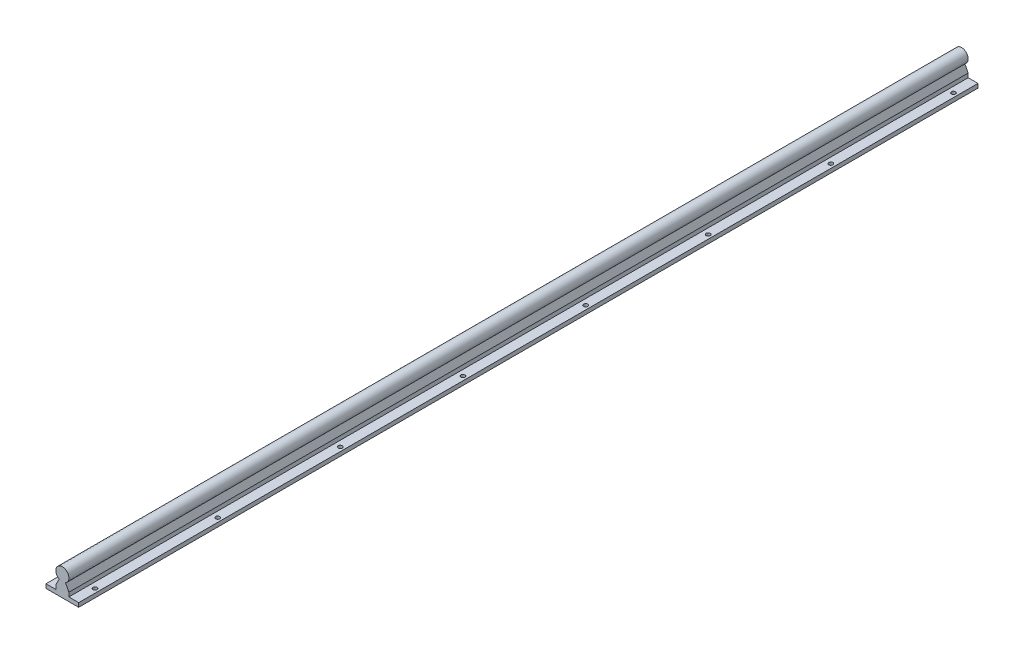
ISO-10303-21;
HEADER;
FILE_DESCRIPTION(('STEP AP214'),'2;1');
FILE_NAME('part.step','',(''),(''),'','','');
FILE_SCHEMA(('AUTOMOTIVE_DESIGN { 1 0 10303 214 1 1 1 1 }'));
ENDSEC;
DATA;
#1=APPLICATION_CONTEXT('core data for automotive mechanical design processes');
#2=APPLICATION_PROTOCOL_DEFINITION('international standard','automotive_design',2000,#1);
#3=PRODUCT_CONTEXT('',#1,'mechanical');
#4=PRODUCT('Part','Part','',(#3));
#5=PRODUCT_RELATED_PRODUCT_CATEGORY('part','',(#4));
#6=PRODUCT_DEFINITION_FORMATION('','',#4);
#7=PRODUCT_DEFINITION_CONTEXT('part definition',#1,'design');
#8=PRODUCT_DEFINITION('design','',#6,#7);
#9=PRODUCT_DEFINITION_SHAPE('','',#8);
#10=(LENGTH_UNIT() NAMED_UNIT(*) SI_UNIT(.MILLI.,.METRE.));
#11=(NAMED_UNIT(*) PLANE_ANGLE_UNIT() SI_UNIT($,.RADIAN.));
#12=(NAMED_UNIT(*) SI_UNIT($,.STERADIAN.) SOLID_ANGLE_UNIT());
#13=UNCERTAINTY_MEASURE_WITH_UNIT(LENGTH_MEASURE(1.E-05),#10,'distance_accuracy_value','');
#14=(GEOMETRIC_REPRESENTATION_CONTEXT(3) GLOBAL_UNCERTAINTY_ASSIGNED_CONTEXT((#13)) GLOBAL_UNIT_ASSIGNED_CONTEXT((#10,
#11,#12)) REPRESENTATION_CONTEXT('',''));
#15=CARTESIAN_POINT('',(0.,0.,0.));
#16=DIRECTION('',(0.,0.,1.));
#17=DIRECTION('',(1.,0.,0.));
#18=AXIS2_PLACEMENT_3D('',#15,#16,#17);
#19=CARTESIAN_POINT('',(-10.3929134539516,5.36146586323541,1100.));
#20=DIRECTION('',(-0.888711896714191,0.458466099770382,0.));
#21=DIRECTION('',(-0.458466099770382,-0.888711896714191,0.));
#22=AXIS2_PLACEMENT_3D('',#19,#20,#21);
#23=PLANE('',#22);
#24=DIRECTION('',(0.458466099770382,0.888711896714191,0.));
#25=VECTOR('',#24,1.);
#26=CARTESIAN_POINT('',(-10.3929134539516,5.36146586323541,0.));
#27=LINE('',#26,#25);
#28=CARTESIAN_POINT('',(-8.,10.,0.));
#29=VERTEX_POINT('',#28);
#30=CARTESIAN_POINT('',(-3.87298334620742,18.,0.));
#31=VERTEX_POINT('',#30);
#32=EDGE_CURVE('E145',#29,#31,#27,.T.);
#33=ORIENTED_EDGE('',*,*,#32,.F.);
#34=DIRECTION('',(0.,0.,-1.));
#35=VECTOR('',#34,1.);
#36=CARTESIAN_POINT('',(-8.,10.,1100.));
#37=LINE('',#36,#35);
#38=CARTESIAN_POINT('',(-8.,10.,1100.));
#39=VERTEX_POINT('',#38);
#40=EDGE_CURVE('E42',#39,#29,#37,.T.);
#41=ORIENTED_EDGE('',*,*,#40,.F.);
#42=DIRECTION('',(0.458466099770382,0.888711896714191,0.));
#43=VECTOR('',#42,1.);
#44=CARTESIAN_POINT('',(-10.3929134539516,5.36146586323541,1100.));
#45=LINE('',#44,#43);
#46=CARTESIAN_POINT('',(-3.87298334620742,18.,1100.));
#47=VERTEX_POINT('',#46);
#48=EDGE_CURVE('E166',#39,#47,#45,.T.);
#49=ORIENTED_EDGE('',*,*,#48,.T.);
#50=DIRECTION('',(0.,0.,-1.));
#51=VECTOR('',#50,1.);
#52=CARTESIAN_POINT('',(-3.87298334620742,18.,1100.));
#53=LINE('',#52,#51);
#54=EDGE_CURVE('E11',#47,#31,#53,.T.);
#55=ORIENTED_EDGE('',*,*,#54,.T.);
#56=EDGE_LOOP('',(#33,#41,#49,#55));
#57=FACE_BOUND('',#56,.T.);
#58=ADVANCED_FACE('F34',(#57),#23,.T.);
#59=CARTESIAN_POINT('',(-8.,0.,1100.));
#60=DIRECTION('',(-1.,0.,0.));
#61=DIRECTION('',(0.,0.,1.));
#62=AXIS2_PLACEMENT_3D('',#59,#60,#61);
#63=PLANE('',#62);
#64=DIRECTION('',(0.,1.,0.));
#65=VECTOR('',#64,1.);
#66=CARTESIAN_POINT('',(-8.,0.,0.));
#67=LINE('',#66,#65);
#68=CARTESIAN_POINT('',(-8.,5.,0.));
#69=VERTEX_POINT('',#68);
#70=EDGE_CURVE('E147',#69,#29,#67,.T.);
#71=ORIENTED_EDGE('',*,*,#70,.F.);
#72=DIRECTION('',(0.,0.,-1.));
#73=VECTOR('',#72,1.);
#74=CARTESIAN_POINT('',(-8.,5.,1100.));
#75=LINE('',#74,#73);
#76=CARTESIAN_POINT('',(-8.,5.,1100.));
#77=VERTEX_POINT('',#76);
#78=EDGE_CURVE('E176',#77,#69,#75,.T.);
#79=ORIENTED_EDGE('',*,*,#78,.F.);
#80=DIRECTION('',(0.,1.,0.));
#81=VECTOR('',#80,1.);
#82=CARTESIAN_POINT('',(-8.,0.,1100.));
#83=LINE('',#82,#81);
#84=EDGE_CURVE('E182',#77,#39,#83,.T.);
#85=ORIENTED_EDGE('',*,*,#84,.T.);
#86=ORIENTED_EDGE('',*,*,#40,.T.);
#87=EDGE_LOOP('',(#71,#79,#85,#86));
#88=FACE_BOUND('',#87,.T.);
#89=ADVANCED_FACE('F180',(#88),#63,.T.);
#90=CARTESIAN_POINT('',(0.,5.,1100.));
#91=DIRECTION('',(0.,1.,0.));
#92=DIRECTION('',(0.,0.,1.));
#93=AXIS2_PLACEMENT_3D('',#90,#91,#92);
#94=PLANE('',#93);
#95=CARTESIAN_POINT('',(-15.,5.,25.0000000000001));
#96=DIRECTION('',(0.,1.,0.));
#97=DIRECTION('',(0.,0.,1.));
#98=AXIS2_PLACEMENT_3D('',#95,#96,#97);
#99=CIRCLE('',#98,2.49999999999999);
#100=CARTESIAN_POINT('',(-15.,5.,27.5000000000001));
#101=VERTEX_POINT('',#100);
#102=EDGE_CURVE('E305',#101,#101,#99,.T.);
#103=ORIENTED_EDGE('',*,*,#102,.F.);
#104=EDGE_LOOP('',(#103));
#105=FACE_BOUND('',#104,.T.);
#106=CARTESIAN_POINT('',(-15.,5.,175.));
#107=DIRECTION('',(0.,1.,0.));
#108=DIRECTION('',(0.,0.,1.));
#109=AXIS2_PLACEMENT_3D('',#106,#107,#108);
#110=CIRCLE('',#109,2.49999999999999);
#111=CARTESIAN_POINT('',(-15.,5.,177.5));
#112=VERTEX_POINT('',#111);
#113=EDGE_CURVE('E293',#112,#112,#110,.T.);
#114=ORIENTED_EDGE('',*,*,#113,.F.);
#115=EDGE_LOOP('',(#114));
#116=FACE_BOUND('',#115,.T.);
#117=CARTESIAN_POINT('',(-15.,5.,325.));
#118=DIRECTION('',(0.,1.,0.));
#119=DIRECTION('',(0.,0.,1.));
#120=AXIS2_PLACEMENT_3D('',#117,#118,#119);
#121=CIRCLE('',#120,2.49999999999999);
#122=CARTESIAN_POINT('',(-15.,5.,327.5));
#123=VERTEX_POINT('',#122);
#124=EDGE_CURVE('E281',#123,#123,#121,.T.);
#125=ORIENTED_EDGE('',*,*,#124,.F.);
#126=EDGE_LOOP('',(#125));
#127=FACE_BOUND('',#126,.T.);
#128=CARTESIAN_POINT('',(-15.,5.,475.));
#129=DIRECTION('',(0.,1.,0.));
#130=DIRECTION('',(0.,0.,1.));
#131=AXIS2_PLACEMENT_3D('',#128,#129,#130);
#132=CIRCLE('',#131,2.49999999999999);
#133=CARTESIAN_POINT('',(-15.,5.,477.5));
#134=VERTEX_POINT('',#133);
#135=EDGE_CURVE('E269',#134,#134,#132,.T.);
#136=ORIENTED_EDGE('',*,*,#135,.F.);
#137=EDGE_LOOP('',(#136));
#138=FACE_BOUND('',#137,.T.);
#139=CARTESIAN_POINT('',(-15.,5.,625.));
#140=DIRECTION('',(0.,1.,0.));
#141=DIRECTION('',(0.,0.,1.));
#142=AXIS2_PLACEMENT_3D('',#139,#140,#141);
#143=CIRCLE('',#142,2.49999999999999);
#144=CARTESIAN_POINT('',(-15.,5.,627.5));
#145=VERTEX_POINT('',#144);
#146=EDGE_CURVE('E257',#145,#145,#143,.T.);
#147=ORIENTED_EDGE('',*,*,#146,.F.);
#148=EDGE_LOOP('',(#147));
#149=FACE_BOUND('',#148,.T.);
#150=CARTESIAN_POINT('',(-15.,5.,775.));
#151=DIRECTION('',(0.,1.,0.));
#152=DIRECTION('',(0.,0.,1.));
#153=AXIS2_PLACEMENT_3D('',#150,#151,#152);
#154=CIRCLE('',#153,2.49999999999999);
#155=CARTESIAN_POINT('',(-15.,5.,777.5));
#156=VERTEX_POINT('',#155);
#157=EDGE_CURVE('E245',#156,#156,#154,.T.);
#158=ORIENTED_EDGE('',*,*,#157,.F.);
#159=EDGE_LOOP('',(#158));
#160=FACE_BOUND('',#159,.T.);
#161=CARTESIAN_POINT('',(-15.,5.,925.));
#162=DIRECTION('',(0.,1.,0.));
#163=DIRECTION('',(0.,0.,1.));
#164=AXIS2_PLACEMENT_3D('',#161,#162,#163);
#165=CIRCLE('',#164,2.49999999999999);
#166=CARTESIAN_POINT('',(-15.,5.,927.5));
#167=VERTEX_POINT('',#166);
#168=EDGE_CURVE('E233',#167,#167,#165,.T.);
#169=ORIENTED_EDGE('',*,*,#168,.F.);
#170=EDGE_LOOP('',(#169));
#171=FACE_BOUND('',#170,.T.);
#172=CARTESIAN_POINT('',(-15.,5.,1075.));
#173=DIRECTION('',(0.,1.,0.));
#174=DIRECTION('',(0.,0.,1.));
#175=AXIS2_PLACEMENT_3D('',#172,#173,#174);
#176=CIRCLE('',#175,2.49999999999999);
#177=CARTESIAN_POINT('',(-15.,5.,1077.5));
#178=VERTEX_POINT('',#177);
#179=EDGE_CURVE('E219',#178,#178,#176,.T.);
#180=ORIENTED_EDGE('',*,*,#179,.F.);
#181=EDGE_LOOP('',(#180));
#182=FACE_BOUND('',#181,.T.);
#183=DIRECTION('',(1.,0.,0.));
#184=VECTOR('',#183,1.);
#185=CARTESIAN_POINT('',(0.,5.,0.));
#186=LINE('',#185,#184);
#187=CARTESIAN_POINT('',(-20.,5.,0.));
#188=VERTEX_POINT('',#187);
#189=EDGE_CURVE('E151',#188,#69,#186,.T.);
#190=ORIENTED_EDGE('',*,*,#189,.F.);
#191=DIRECTION('',(0.,0.,-1.));
#192=VECTOR('',#191,1.);
#193=CARTESIAN_POINT('',(-20.,5.,1100.));
#194=LINE('',#193,#192);
#195=CARTESIAN_POINT('',(-20.,5.,1100.));
#196=VERTEX_POINT('',#195);
#197=EDGE_CURVE('E174',#196,#188,#194,.T.);
#198=ORIENTED_EDGE('',*,*,#197,.F.);
#199=DIRECTION('',(1.,0.,0.));
#200=VECTOR('',#199,1.);
#201=CARTESIAN_POINT('',(0.,5.,1100.));
#202=LINE('',#201,#200);
#203=EDGE_CURVE('E192',#196,#77,#202,.T.);
#204=ORIENTED_EDGE('',*,*,#203,.T.);
#205=ORIENTED_EDGE('',*,*,#78,.T.);
#206=EDGE_LOOP('',(#190,#198,#204,#205));
#207=FACE_BOUND('',#206,.T.);
#208=ADVANCED_FACE('F189',(#105,#116,#127,#138,#149,#160,#171,#182,#207),#94,.T.);
#209=CARTESIAN_POINT('',(-20.,0.,1100.));
#210=DIRECTION('',(-1.,0.,0.));
#211=DIRECTION('',(0.,0.,1.));
#212=AXIS2_PLACEMENT_3D('',#209,#210,#211);
#213=PLANE('',#212);
#214=DIRECTION('',(0.,1.,0.));
#215=VECTOR('',#214,1.);
#216=CARTESIAN_POINT('',(-20.,0.,0.));
#217=LINE('',#216,#215);
#218=CARTESIAN_POINT('',(-20.,0.,0.));
#219=VERTEX_POINT('',#218);
#220=EDGE_CURVE('E154',#219,#188,#217,.T.);
#221=ORIENTED_EDGE('',*,*,#220,.F.);
#222=DIRECTION('',(0.,0.,-1.));
#223=VECTOR('',#222,1.);
#224=CARTESIAN_POINT('',(-20.,0.,1100.));
#225=LINE('',#224,#223);
#226=CARTESIAN_POINT('',(-20.,0.,1100.));
#227=VERTEX_POINT('',#226);
#228=EDGE_CURVE('E172',#227,#219,#225,.T.);
#229=ORIENTED_EDGE('',*,*,#228,.F.);
#230=DIRECTION('',(0.,1.,0.));
#231=VECTOR('',#230,1.);
#232=CARTESIAN_POINT('',(-20.,0.,1100.));
#233=LINE('',#232,#231);
#234=EDGE_CURVE('E196',#227,#196,#233,.T.);
#235=ORIENTED_EDGE('',*,*,#234,.T.);
#236=ORIENTED_EDGE('',*,*,#197,.T.);
#237=EDGE_LOOP('',(#221,#229,#235,#236));
#238=FACE_BOUND('',#237,.T.);
#239=ADVANCED_FACE('F202',(#238),#213,.T.);
#240=CARTESIAN_POINT('',(0.,0.,1100.));
#241=DIRECTION('',(0.,1.,0.));
#242=DIRECTION('',(0.,0.,1.));
#243=AXIS2_PLACEMENT_3D('',#240,#241,#242);
#244=PLANE('',#243);
#245=CARTESIAN_POINT('',(15.,0.,25.0000000000001));
#246=DIRECTION('',(0.,1.,0.));
#247=DIRECTION('',(0.,0.,1.));
#248=AXIS2_PLACEMENT_3D('',#245,#246,#247);
#249=CIRCLE('',#248,2.5);
#250=CARTESIAN_POINT('',(15.,0.,27.5000000000001));
#251=VERTEX_POINT('',#250);
#252=EDGE_CURVE('E308',#251,#251,#249,.T.);
#253=ORIENTED_EDGE('',*,*,#252,.T.);
#254=EDGE_LOOP('',(#253));
#255=FACE_BOUND('',#254,.T.);
#256=CARTESIAN_POINT('',(-15.,0.,25.0000000000001));
#257=DIRECTION('',(0.,1.,0.));
#258=DIRECTION('',(0.,0.,1.));
#259=AXIS2_PLACEMENT_3D('',#256,#257,#258);
#260=CIRCLE('',#259,2.5);
#261=CARTESIAN_POINT('',(-15.,0.,27.5000000000001));
#262=VERTEX_POINT('',#261);
#263=EDGE_CURVE('E302',#262,#262,#260,.T.);
#264=ORIENTED_EDGE('',*,*,#263,.T.);
#265=EDGE_LOOP('',(#264));
#266=FACE_BOUND('',#265,.T.);
#267=CARTESIAN_POINT('',(15.,0.,175.));
#268=DIRECTION('',(0.,1.,0.));
#269=DIRECTION('',(0.,0.,1.));
#270=AXIS2_PLACEMENT_3D('',#267,#268,#269);
#271=CIRCLE('',#270,2.5);
#272=CARTESIAN_POINT('',(15.,0.,177.5));
#273=VERTEX_POINT('',#272);
#274=EDGE_CURVE('E296',#273,#273,#271,.T.);
#275=ORIENTED_EDGE('',*,*,#274,.T.);
#276=EDGE_LOOP('',(#275));
#277=FACE_BOUND('',#276,.T.);
#278=CARTESIAN_POINT('',(-15.,0.,175.));
#279=DIRECTION('',(0.,1.,0.));
#280=DIRECTION('',(0.,0.,1.));
#281=AXIS2_PLACEMENT_3D('',#278,#279,#280);
#282=CIRCLE('',#281,2.5);
#283=CARTESIAN_POINT('',(-15.,0.,177.5));
#284=VERTEX_POINT('',#283);
#285=EDGE_CURVE('E290',#284,#284,#282,.T.);
#286=ORIENTED_EDGE('',*,*,#285,.T.);
#287=EDGE_LOOP('',(#286));
#288=FACE_BOUND('',#287,.T.);
#289=CARTESIAN_POINT('',(15.,0.,325.));
#290=DIRECTION('',(0.,1.,0.));
#291=DIRECTION('',(0.,0.,1.));
#292=AXIS2_PLACEMENT_3D('',#289,#290,#291);
#293=CIRCLE('',#292,2.5);
#294=CARTESIAN_POINT('',(15.,0.,327.5));
#295=VERTEX_POINT('',#294);
#296=EDGE_CURVE('E284',#295,#295,#293,.T.);
#297=ORIENTED_EDGE('',*,*,#296,.T.);
#298=EDGE_LOOP('',(#297));
#299=FACE_BOUND('',#298,.T.);
#300=CARTESIAN_POINT('',(-15.,0.,325.));
#301=DIRECTION('',(0.,1.,0.));
#302=DIRECTION('',(0.,0.,1.));
#303=AXIS2_PLACEMENT_3D('',#300,#301,#302);
#304=CIRCLE('',#303,2.5);
#305=CARTESIAN_POINT('',(-15.,0.,327.5));
#306=VERTEX_POINT('',#305);
#307=EDGE_CURVE('E278',#306,#306,#304,.T.);
#308=ORIENTED_EDGE('',*,*,#307,.T.);
#309=EDGE_LOOP('',(#308));
#310=FACE_BOUND('',#309,.T.);
#311=CARTESIAN_POINT('',(15.,0.,475.));
#312=DIRECTION('',(0.,1.,0.));
#313=DIRECTION('',(0.,0.,1.));
#314=AXIS2_PLACEMENT_3D('',#311,#312,#313);
#315=CIRCLE('',#314,2.5);
#316=CARTESIAN_POINT('',(15.,0.,477.5));
#317=VERTEX_POINT('',#316);
#318=EDGE_CURVE('E272',#317,#317,#315,.T.);
#319=ORIENTED_EDGE('',*,*,#318,.T.);
#320=EDGE_LOOP('',(#319));
#321=FACE_BOUND('',#320,.T.);
#322=CARTESIAN_POINT('',(-15.,0.,475.));
#323=DIRECTION('',(0.,1.,0.));
#324=DIRECTION('',(0.,0.,1.));
#325=AXIS2_PLACEMENT_3D('',#322,#323,#324);
#326=CIRCLE('',#325,2.5);
#327=CARTESIAN_POINT('',(-15.,0.,477.5));
#328=VERTEX_POINT('',#327);
#329=EDGE_CURVE('E266',#328,#328,#326,.T.);
#330=ORIENTED_EDGE('',*,*,#329,.T.);
#331=EDGE_LOOP('',(#330));
#332=FACE_BOUND('',#331,.T.);
#333=CARTESIAN_POINT('',(15.,0.,625.));
#334=DIRECTION('',(0.,1.,0.));
#335=DIRECTION('',(0.,0.,1.));
#336=AXIS2_PLACEMENT_3D('',#333,#334,#335);
#337=CIRCLE('',#336,2.5);
#338=CARTESIAN_POINT('',(15.,0.,627.5));
#339=VERTEX_POINT('',#338);
#340=EDGE_CURVE('E260',#339,#339,#337,.T.);
#341=ORIENTED_EDGE('',*,*,#340,.T.);
#342=EDGE_LOOP('',(#341));
#343=FACE_BOUND('',#342,.T.);
#344=CARTESIAN_POINT('',(-15.,0.,625.));
#345=DIRECTION('',(0.,1.,0.));
#346=DIRECTION('',(0.,0.,1.));
#347=AXIS2_PLACEMENT_3D('',#344,#345,#346);
#348=CIRCLE('',#347,2.5);
#349=CARTESIAN_POINT('',(-15.,0.,627.5));
#350=VERTEX_POINT('',#349);
#351=EDGE_CURVE('E254',#350,#350,#348,.T.);
#352=ORIENTED_EDGE('',*,*,#351,.T.);
#353=EDGE_LOOP('',(#352));
#354=FACE_BOUND('',#353,.T.);
#355=CARTESIAN_POINT('',(15.,0.,775.));
#356=DIRECTION('',(0.,1.,0.));
#357=DIRECTION('',(0.,0.,1.));
#358=AXIS2_PLACEMENT_3D('',#355,#356,#357);
#359=CIRCLE('',#358,2.5);
#360=CARTESIAN_POINT('',(15.,0.,777.5));
#361=VERTEX_POINT('',#360);
#362=EDGE_CURVE('E248',#361,#361,#359,.T.);
#363=ORIENTED_EDGE('',*,*,#362,.T.);
#364=EDGE_LOOP('',(#363));
#365=FACE_BOUND('',#364,.T.);
#366=CARTESIAN_POINT('',(-15.,0.,775.));
#367=DIRECTION('',(0.,1.,0.));
#368=DIRECTION('',(0.,0.,1.));
#369=AXIS2_PLACEMENT_3D('',#366,#367,#368);
#370=CIRCLE('',#369,2.5);
#371=CARTESIAN_POINT('',(-15.,0.,777.5));
#372=VERTEX_POINT('',#371);
#373=EDGE_CURVE('E242',#372,#372,#370,.T.);
#374=ORIENTED_EDGE('',*,*,#373,.T.);
#375=EDGE_LOOP('',(#374));
#376=FACE_BOUND('',#375,.T.);
#377=CARTESIAN_POINT('',(15.,0.,925.));
#378=DIRECTION('',(0.,1.,0.));
#379=DIRECTION('',(0.,0.,1.));
#380=AXIS2_PLACEMENT_3D('',#377,#378,#379);
#381=CIRCLE('',#380,2.5);
#382=CARTESIAN_POINT('',(15.,0.,927.5));
#383=VERTEX_POINT('',#382);
#384=EDGE_CURVE('E236',#383,#383,#381,.T.);
#385=ORIENTED_EDGE('',*,*,#384,.T.);
#386=EDGE_LOOP('',(#385));
#387=FACE_BOUND('',#386,.T.);
#388=CARTESIAN_POINT('',(-15.,0.,925.));
#389=DIRECTION('',(0.,1.,0.));
#390=DIRECTION('',(0.,0.,1.));
#391=AXIS2_PLACEMENT_3D('',#388,#389,#390);
#392=CIRCLE('',#391,2.5);
#393=CARTESIAN_POINT('',(-15.,0.,927.5));
#394=VERTEX_POINT('',#393);
#395=EDGE_CURVE('E230',#394,#394,#392,.T.);
#396=ORIENTED_EDGE('',*,*,#395,.T.);
#397=EDGE_LOOP('',(#396));
#398=FACE_BOUND('',#397,.T.);
#399=CARTESIAN_POINT('',(15.,0.,1075.));
#400=DIRECTION('',(0.,1.,0.));
#401=DIRECTION('',(0.,0.,1.));
#402=AXIS2_PLACEMENT_3D('',#399,#400,#401);
#403=CIRCLE('',#402,2.5);
#404=CARTESIAN_POINT('',(15.,0.,1077.5));
#405=VERTEX_POINT('',#404);
#406=EDGE_CURVE('E224',#405,#405,#403,.T.);
#407=ORIENTED_EDGE('',*,*,#406,.T.);
#408=EDGE_LOOP('',(#407));
#409=FACE_BOUND('',#408,.T.);
#410=CARTESIAN_POINT('',(-15.,0.,1075.));
#411=DIRECTION('',(0.,1.,0.));
#412=DIRECTION('',(0.,0.,1.));
#413=AXIS2_PLACEMENT_3D('',#410,#411,#412);
#414=CIRCLE('',#413,2.5);
#415=CARTESIAN_POINT('',(-15.,0.,1077.5));
#416=VERTEX_POINT('',#415);
#417=EDGE_CURVE('E216',#416,#416,#414,.T.);
#418=ORIENTED_EDGE('',*,*,#417,.T.);
#419=EDGE_LOOP('',(#418));
#420=FACE_BOUND('',#419,.T.);
#421=DIRECTION('',(1.,0.,0.));
#422=VECTOR('',#421,1.);
#423=CARTESIAN_POINT('',(0.,0.,0.));
#424=LINE('',#423,#422);
#425=CARTESIAN_POINT('',(20.,0.,0.));
#426=VERTEX_POINT('',#425);
#427=EDGE_CURVE('E157',#219,#426,#424,.T.);
#428=ORIENTED_EDGE('',*,*,#427,.T.);
#429=DIRECTION('',(0.,0.,-1.));
#430=VECTOR('',#429,1.);
#431=CARTESIAN_POINT('',(20.,0.,1100.));
#432=LINE('',#431,#430);
#433=CARTESIAN_POINT('',(20.,0.,1100.));
#434=VERTEX_POINT('',#433);
#435=EDGE_CURVE('E134',#434,#426,#432,.T.);
#436=ORIENTED_EDGE('',*,*,#435,.F.);
#437=DIRECTION('',(1.,0.,0.));
#438=VECTOR('',#437,1.);
#439=CARTESIAN_POINT('',(0.,0.,1100.));
#440=LINE('',#439,#438);
#441=EDGE_CURVE('E122',#227,#434,#440,.T.);
#442=ORIENTED_EDGE('',*,*,#441,.F.);
#443=ORIENTED_EDGE('',*,*,#228,.T.);
#444=EDGE_LOOP('',(#428,#436,#442,#443));
#445=FACE_BOUND('',#444,.T.);
#446=ADVANCED_FACE('F204',(#255,#266,#277,#288,#299,#310,#321,#332,#343,#354,#365,#376,#387,
#398,#409,#420,#445),#244,.F.);
#447=CARTESIAN_POINT('',(20.,0.,1100.));
#448=DIRECTION('',(-1.,0.,0.));
#449=DIRECTION('',(0.,0.,1.));
#450=AXIS2_PLACEMENT_3D('',#447,#448,#449);
#451=PLANE('',#450);
#452=DIRECTION('',(0.,1.,0.));
#453=VECTOR('',#452,1.);
#454=CARTESIAN_POINT('',(20.,0.,0.));
#455=LINE('',#454,#453);
#456=CARTESIAN_POINT('',(20.,5.,0.));
#457=VERTEX_POINT('',#456);
#458=EDGE_CURVE('E131',#426,#457,#455,.T.);
#459=ORIENTED_EDGE('',*,*,#458,.T.);
#460=DIRECTION('',(0.,0.,-1.));
#461=VECTOR('',#460,1.);
#462=CARTESIAN_POINT('',(20.,5.,1100.));
#463=LINE('',#462,#461);
#464=CARTESIAN_POINT('',(20.,5.,1100.));
#465=VERTEX_POINT('',#464);
#466=EDGE_CURVE('E128',#465,#457,#463,.T.);
#467=ORIENTED_EDGE('',*,*,#466,.F.);
#468=DIRECTION('',(0.,1.,0.));
#469=VECTOR('',#468,1.);
#470=CARTESIAN_POINT('',(20.,0.,1100.));
#471=LINE('',#470,#469);
#472=EDGE_CURVE('E114',#434,#465,#471,.T.);
#473=ORIENTED_EDGE('',*,*,#472,.F.);
#474=ORIENTED_EDGE('',*,*,#435,.T.);
#475=EDGE_LOOP('',(#459,#467,#473,#474));
#476=FACE_BOUND('',#475,.T.);
#477=ADVANCED_FACE('F129',(#476),#451,.F.);
#478=CARTESIAN_POINT('',(0.,5.,1100.));
#479=DIRECTION('',(0.,-1.,0.));
#480=DIRECTION('',(0.,0.,-1.));
#481=AXIS2_PLACEMENT_3D('',#478,#479,#480);
#482=PLANE('',#481);
#483=CARTESIAN_POINT('',(15.,5.,25.0000000000001));
#484=DIRECTION('',(0.,1.,0.));
#485=DIRECTION('',(0.,0.,1.));
#486=AXIS2_PLACEMENT_3D('',#483,#484,#485);
#487=CIRCLE('',#486,2.49999999999999);
#488=CARTESIAN_POINT('',(15.,5.,27.5000000000001));
#489=VERTEX_POINT('',#488);
#490=EDGE_CURVE('E311',#489,#489,#487,.T.);
#491=ORIENTED_EDGE('',*,*,#490,.F.);
#492=EDGE_LOOP('',(#491));
#493=FACE_BOUND('',#492,.T.);
#494=CARTESIAN_POINT('',(15.,5.,175.));
#495=DIRECTION('',(0.,1.,0.));
#496=DIRECTION('',(0.,0.,1.));
#497=AXIS2_PLACEMENT_3D('',#494,#495,#496);
#498=CIRCLE('',#497,2.49999999999999);
#499=CARTESIAN_POINT('',(15.,5.,177.5));
#500=VERTEX_POINT('',#499);
#501=EDGE_CURVE('E299',#500,#500,#498,.T.);
#502=ORIENTED_EDGE('',*,*,#501,.F.);
#503=EDGE_LOOP('',(#502));
#504=FACE_BOUND('',#503,.T.);
#505=CARTESIAN_POINT('',(15.,5.,325.));
#506=DIRECTION('',(0.,1.,0.));
#507=DIRECTION('',(0.,0.,1.));
#508=AXIS2_PLACEMENT_3D('',#505,#506,#507);
#509=CIRCLE('',#508,2.49999999999999);
#510=CARTESIAN_POINT('',(15.,5.,327.5));
#511=VERTEX_POINT('',#510);
#512=EDGE_CURVE('E287',#511,#511,#509,.T.);
#513=ORIENTED_EDGE('',*,*,#512,.F.);
#514=EDGE_LOOP('',(#513));
#515=FACE_BOUND('',#514,.T.);
#516=CARTESIAN_POINT('',(15.,5.,475.));
#517=DIRECTION('',(0.,1.,0.));
#518=DIRECTION('',(0.,0.,1.));
#519=AXIS2_PLACEMENT_3D('',#516,#517,#518);
#520=CIRCLE('',#519,2.49999999999999);
#521=CARTESIAN_POINT('',(15.,5.,477.5));
#522=VERTEX_POINT('',#521);
#523=EDGE_CURVE('E275',#522,#522,#520,.T.);
#524=ORIENTED_EDGE('',*,*,#523,.F.);
#525=EDGE_LOOP('',(#524));
#526=FACE_BOUND('',#525,.T.);
#527=CARTESIAN_POINT('',(15.,5.,625.));
#528=DIRECTION('',(0.,1.,0.));
#529=DIRECTION('',(0.,0.,1.));
#530=AXIS2_PLACEMENT_3D('',#527,#528,#529);
#531=CIRCLE('',#530,2.49999999999999);
#532=CARTESIAN_POINT('',(15.,5.,627.5));
#533=VERTEX_POINT('',#532);
#534=EDGE_CURVE('E263',#533,#533,#531,.T.);
#535=ORIENTED_EDGE('',*,*,#534,.F.);
#536=EDGE_LOOP('',(#535));
#537=FACE_BOUND('',#536,.T.);
#538=CARTESIAN_POINT('',(15.,5.,775.));
#539=DIRECTION('',(0.,1.,0.));
#540=DIRECTION('',(0.,0.,1.));
#541=AXIS2_PLACEMENT_3D('',#538,#539,#540);
#542=CIRCLE('',#541,2.49999999999999);
#543=CARTESIAN_POINT('',(15.,5.,777.5));
#544=VERTEX_POINT('',#543);
#545=EDGE_CURVE('E251',#544,#544,#542,.T.);
#546=ORIENTED_EDGE('',*,*,#545,.F.);
#547=EDGE_LOOP('',(#546));
#548=FACE_BOUND('',#547,.T.);
#549=CARTESIAN_POINT('',(15.,5.,925.));
#550=DIRECTION('',(0.,1.,0.));
#551=DIRECTION('',(0.,0.,1.));
#552=AXIS2_PLACEMENT_3D('',#549,#550,#551);
#553=CIRCLE('',#552,2.49999999999999);
#554=CARTESIAN_POINT('',(15.,5.,927.5));
#555=VERTEX_POINT('',#554);
#556=EDGE_CURVE('E239',#555,#555,#553,.T.);
#557=ORIENTED_EDGE('',*,*,#556,.F.);
#558=EDGE_LOOP('',(#557));
#559=FACE_BOUND('',#558,.T.);
#560=CARTESIAN_POINT('',(15.,5.,1075.));
#561=DIRECTION('',(0.,1.,0.));
#562=DIRECTION('',(0.,0.,1.));
#563=AXIS2_PLACEMENT_3D('',#560,#561,#562);
#564=CIRCLE('',#563,2.49999999999999);
#565=CARTESIAN_POINT('',(15.,5.,1077.5));
#566=VERTEX_POINT('',#565);
#567=EDGE_CURVE('E227',#566,#566,#564,.T.);
#568=ORIENTED_EDGE('',*,*,#567,.F.);
#569=EDGE_LOOP('',(#568));
#570=FACE_BOUND('',#569,.T.);
#571=DIRECTION('',(-1.,0.,0.));
#572=VECTOR('',#571,1.);
#573=CARTESIAN_POINT('',(0.,5.,0.));
#574=LINE('',#573,#572);
#575=CARTESIAN_POINT('',(8.,5.,0.));
#576=VERTEX_POINT('',#575);
#577=EDGE_CURVE('E160',#457,#576,#574,.T.);
#578=ORIENTED_EDGE('',*,*,#577,.T.);
#579=DIRECTION('',(0.,0.,-1.));
#580=VECTOR('',#579,1.);
#581=CARTESIAN_POINT('',(8.,5.,1100.));
#582=LINE('',#581,#580);
#583=CARTESIAN_POINT('',(8.,5.,1100.));
#584=VERTEX_POINT('',#583);
#585=EDGE_CURVE('E135',#584,#576,#582,.T.);
#586=ORIENTED_EDGE('',*,*,#585,.F.);
#587=DIRECTION('',(-1.,0.,0.));
#588=VECTOR('',#587,1.);
#589=CARTESIAN_POINT('',(0.,5.,1100.));
#590=LINE('',#589,#588);
#591=EDGE_CURVE('E118',#465,#584,#590,.T.);
#592=ORIENTED_EDGE('',*,*,#591,.F.);
#593=ORIENTED_EDGE('',*,*,#466,.T.);
#594=EDGE_LOOP('',(#578,#586,#592,#593));
#595=FACE_BOUND('',#594,.T.);
#596=ADVANCED_FACE('F137',(#493,#504,#515,#526,#537,#548,#559,#570,#595),#482,.F.);
#597=CARTESIAN_POINT('',(8.,0.,1100.));
#598=DIRECTION('',(-1.,0.,0.));
#599=DIRECTION('',(0.,0.,1.));
#600=AXIS2_PLACEMENT_3D('',#597,#598,#599);
#601=PLANE('',#600);
#602=DIRECTION('',(0.,1.,0.));
#603=VECTOR('',#602,1.);
#604=CARTESIAN_POINT('',(8.,0.,0.));
#605=LINE('',#604,#603);
#606=CARTESIAN_POINT('',(8.,10.,0.));
#607=VERTEX_POINT('',#606);
#608=EDGE_CURVE('E82',#576,#607,#605,.T.);
#609=ORIENTED_EDGE('',*,*,#608,.T.);
#610=DIRECTION('',(0.,0.,-1.));
#611=VECTOR('',#610,1.);
#612=CARTESIAN_POINT('',(8.,10.,1100.));
#613=LINE('',#612,#611);
#614=CARTESIAN_POINT('',(8.,10.,1100.));
#615=VERTEX_POINT('',#614);
#616=EDGE_CURVE('E168',#615,#607,#613,.T.);
#617=ORIENTED_EDGE('',*,*,#616,.F.);
#618=DIRECTION('',(0.,1.,0.));
#619=VECTOR('',#618,1.);
#620=CARTESIAN_POINT('',(8.,0.,1100.));
#621=LINE('',#620,#619);
#622=EDGE_CURVE('E50',#584,#615,#621,.T.);
#623=ORIENTED_EDGE('',*,*,#622,.F.);
#624=ORIENTED_EDGE('',*,*,#585,.T.);
#625=EDGE_LOOP('',(#609,#617,#623,#624));
#626=FACE_BOUND('',#625,.T.);
#627=ADVANCED_FACE('F205',(#626),#601,.F.);
#628=CARTESIAN_POINT('',(10.3929134539516,5.36146586323541,1100.));
#629=DIRECTION('',(-0.888711896714191,-0.458466099770382,0.));
#630=DIRECTION('',(0.458466099770382,-0.888711896714191,0.));
#631=AXIS2_PLACEMENT_3D('',#628,#629,#630);
#632=PLANE('',#631);
#633=DIRECTION('',(-0.458466099770382,0.888711896714191,0.));
#634=VECTOR('',#633,1.);
#635=CARTESIAN_POINT('',(10.3929134539516,5.36146586323541,0.));
#636=LINE('',#635,#634);
#637=CARTESIAN_POINT('',(3.87298334620742,18.,0.));
#638=VERTEX_POINT('',#637);
#639=EDGE_CURVE('E163',#607,#638,#636,.T.);
#640=ORIENTED_EDGE('',*,*,#639,.T.);
#641=DIRECTION('',(0.,0.,-1.));
#642=VECTOR('',#641,1.);
#643=CARTESIAN_POINT('',(3.87298334620742,18.,1100.));
#644=LINE('',#643,#642);
#645=CARTESIAN_POINT('',(3.87298334620742,18.,1100.));
#646=VERTEX_POINT('',#645);
#647=EDGE_CURVE('E144',#646,#638,#644,.T.);
#648=ORIENTED_EDGE('',*,*,#647,.F.);
#649=DIRECTION('',(-0.458466099770382,0.888711896714191,0.));
#650=VECTOR('',#649,1.);
#651=CARTESIAN_POINT('',(10.3929134539516,5.36146586323541,1100.));
#652=LINE('',#651,#650);
#653=EDGE_CURVE('E139',#615,#646,#652,.T.);
#654=ORIENTED_EDGE('',*,*,#653,.F.);
#655=ORIENTED_EDGE('',*,*,#616,.T.);
#656=EDGE_LOOP('',(#640,#648,#654,#655));
#657=FACE_BOUND('',#656,.T.);
#658=ADVANCED_FACE('F209',(#657),#632,.F.);
#659=CARTESIAN_POINT('',(0.,0.,1100.));
#660=DIRECTION('',(0.,0.,1.));
#661=DIRECTION('',(1.,0.,0.));
#662=AXIS2_PLACEMENT_3D('',#659,#660,#661);
#663=PLANE('',#662);
#664=ORIENTED_EDGE('',*,*,#653,.T.);
#665=CARTESIAN_POINT('',(0.,25.,1100.));
#666=DIRECTION('',(0.,0.,1.));
#667=DIRECTION('',(1.,0.,0.));
#668=AXIS2_PLACEMENT_3D('',#665,#666,#667);
#669=CIRCLE('',#668,8.);
#670=EDGE_CURVE('E148',#646,#47,#669,.T.);
#671=ORIENTED_EDGE('',*,*,#670,.T.);
#672=ORIENTED_EDGE('',*,*,#48,.F.);
#673=ORIENTED_EDGE('',*,*,#84,.F.);
#674=ORIENTED_EDGE('',*,*,#203,.F.);
#675=ORIENTED_EDGE('',*,*,#234,.F.);
#676=ORIENTED_EDGE('',*,*,#441,.T.);
#677=ORIENTED_EDGE('',*,*,#472,.T.);
#678=ORIENTED_EDGE('',*,*,#591,.T.);
#679=ORIENTED_EDGE('',*,*,#622,.T.);
#680=EDGE_LOOP('',(#664,#671,#672,#673,#674,#675,#676,#677,#678,#679));
#681=FACE_BOUND('',#680,.T.);
#682=ADVANCED_FACE('F116',(#681),#663,.T.);
#683=CARTESIAN_POINT('',(0.,0.,0.));
#684=DIRECTION('',(0.,0.,1.));
#685=DIRECTION('',(1.,0.,0.));
#686=AXIS2_PLACEMENT_3D('',#683,#684,#685);
#687=PLANE('',#686);
#688=ORIENTED_EDGE('',*,*,#32,.T.);
#689=CARTESIAN_POINT('',(0.,25.,0.));
#690=DIRECTION('',(0.,0.,1.));
#691=DIRECTION('',(1.,0.,0.));
#692=AXIS2_PLACEMENT_3D('',#689,#690,#691);
#693=CIRCLE('',#692,8.);
#694=EDGE_CURVE('E90',#638,#31,#693,.T.);
#695=ORIENTED_EDGE('',*,*,#694,.F.);
#696=ORIENTED_EDGE('',*,*,#639,.F.);
#697=ORIENTED_EDGE('',*,*,#608,.F.);
#698=ORIENTED_EDGE('',*,*,#577,.F.);
#699=ORIENTED_EDGE('',*,*,#458,.F.);
#700=ORIENTED_EDGE('',*,*,#427,.F.);
#701=ORIENTED_EDGE('',*,*,#220,.T.);
#702=ORIENTED_EDGE('',*,*,#189,.T.);
#703=ORIENTED_EDGE('',*,*,#70,.T.);
#704=EDGE_LOOP('',(#688,#695,#696,#697,#698,#699,#700,#701,#702,#703));
#705=FACE_BOUND('',#704,.T.);
#706=ADVANCED_FACE('F184',(#705),#687,.F.);
#707=CARTESIAN_POINT('',(0.,25.,1100.));
#708=DIRECTION('',(0.,0.,-1.));
#709=DIRECTION('',(-1.,0.,0.));
#710=AXIS2_PLACEMENT_3D('',#707,#708,#709);
#711=CYLINDRICAL_SURFACE('',#710,8.);
#712=ORIENTED_EDGE('',*,*,#54,.F.);
#713=ORIENTED_EDGE('',*,*,#670,.F.);
#714=ORIENTED_EDGE('',*,*,#647,.T.);
#715=ORIENTED_EDGE('',*,*,#694,.T.);
#716=EDGE_LOOP('',(#712,#713,#714,#715));
#717=FACE_BOUND('',#716,.T.);
#718=ADVANCED_FACE('F215',(#717),#711,.T.);
#719=CARTESIAN_POINT('',(-15.,5.,1075.));
#720=DIRECTION('',(0.,1.,0.));
#721=DIRECTION('',(0.,0.,1.));
#722=AXIS2_PLACEMENT_3D('',#719,#720,#721);
#723=CYLINDRICAL_SURFACE('',#722,2.49999999999999);
#724=ORIENTED_EDGE('',*,*,#417,.F.);
#725=EDGE_LOOP('',(#724));
#726=FACE_BOUND('',#725,.T.);
#727=ORIENTED_EDGE('',*,*,#179,.T.);
#728=EDGE_LOOP('',(#727));
#729=FACE_BOUND('',#728,.T.);
#730=ADVANCED_FACE('F337',(#726,#729),#723,.F.);
#731=CARTESIAN_POINT('',(15.,5.,1075.));
#732=DIRECTION('',(0.,1.,0.));
#733=DIRECTION('',(0.,0.,1.));
#734=AXIS2_PLACEMENT_3D('',#731,#732,#733);
#735=CYLINDRICAL_SURFACE('',#734,2.49999999999999);
#736=ORIENTED_EDGE('',*,*,#406,.F.);
#737=EDGE_LOOP('',(#736));
#738=FACE_BOUND('',#737,.T.);
#739=ORIENTED_EDGE('',*,*,#567,.T.);
#740=EDGE_LOOP('',(#739));
#741=FACE_BOUND('',#740,.T.);
#742=ADVANCED_FACE('F334',(#738,#741),#735,.F.);
#743=CARTESIAN_POINT('',(-15.,5.,925.));
#744=DIRECTION('',(0.,1.,0.));
#745=DIRECTION('',(0.,0.,1.));
#746=AXIS2_PLACEMENT_3D('',#743,#744,#745);
#747=CYLINDRICAL_SURFACE('',#746,2.49999999999999);
#748=ORIENTED_EDGE('',*,*,#395,.F.);
#749=EDGE_LOOP('',(#748));
#750=FACE_BOUND('',#749,.T.);
#751=ORIENTED_EDGE('',*,*,#168,.T.);
#752=EDGE_LOOP('',(#751));
#753=FACE_BOUND('',#752,.T.);
#754=ADVANCED_FACE('F336',(#750,#753),#747,.F.);
#755=CARTESIAN_POINT('',(15.,5.,925.));
#756=DIRECTION('',(0.,1.,0.));
#757=DIRECTION('',(0.,0.,1.));
#758=AXIS2_PLACEMENT_3D('',#755,#756,#757);
#759=CYLINDRICAL_SURFACE('',#758,2.49999999999999);
#760=ORIENTED_EDGE('',*,*,#384,.F.);
#761=EDGE_LOOP('',(#760));
#762=FACE_BOUND('',#761,.T.);
#763=ORIENTED_EDGE('',*,*,#556,.T.);
#764=EDGE_LOOP('',(#763));
#765=FACE_BOUND('',#764,.T.);
#766=ADVANCED_FACE('F344',(#762,#765),#759,.F.);
#767=CARTESIAN_POINT('',(-15.,5.,775.));
#768=DIRECTION('',(0.,1.,0.));
#769=DIRECTION('',(0.,0.,1.));
#770=AXIS2_PLACEMENT_3D('',#767,#768,#769);
#771=CYLINDRICAL_SURFACE('',#770,2.49999999999999);
#772=ORIENTED_EDGE('',*,*,#373,.F.);
#773=EDGE_LOOP('',(#772));
#774=FACE_BOUND('',#773,.T.);
#775=ORIENTED_EDGE('',*,*,#157,.T.);
#776=EDGE_LOOP('',(#775));
#777=FACE_BOUND('',#776,.T.);
#778=ADVANCED_FACE('F415',(#774,#777),#771,.F.);
#779=CARTESIAN_POINT('',(15.,5.,775.));
#780=DIRECTION('',(0.,1.,0.));
#781=DIRECTION('',(0.,0.,1.));
#782=AXIS2_PLACEMENT_3D('',#779,#780,#781);
#783=CYLINDRICAL_SURFACE('',#782,2.49999999999999);
#784=ORIENTED_EDGE('',*,*,#362,.F.);
#785=EDGE_LOOP('',(#784));
#786=FACE_BOUND('',#785,.T.);
#787=ORIENTED_EDGE('',*,*,#545,.T.);
#788=EDGE_LOOP('',(#787));
#789=FACE_BOUND('',#788,.T.);
#790=ADVANCED_FACE('F425',(#786,#789),#783,.F.);
#791=CARTESIAN_POINT('',(-15.,5.,625.));
#792=DIRECTION('',(0.,1.,0.));
#793=DIRECTION('',(0.,0.,1.));
#794=AXIS2_PLACEMENT_3D('',#791,#792,#793);
#795=CYLINDRICAL_SURFACE('',#794,2.49999999999999);
#796=ORIENTED_EDGE('',*,*,#351,.F.);
#797=EDGE_LOOP('',(#796));
#798=FACE_BOUND('',#797,.T.);
#799=ORIENTED_EDGE('',*,*,#146,.T.);
#800=EDGE_LOOP('',(#799));
#801=FACE_BOUND('',#800,.T.);
#802=ADVANCED_FACE('F435',(#798,#801),#795,.F.);
#803=CARTESIAN_POINT('',(15.,5.,625.));
#804=DIRECTION('',(0.,1.,0.));
#805=DIRECTION('',(0.,0.,1.));
#806=AXIS2_PLACEMENT_3D('',#803,#804,#805);
#807=CYLINDRICAL_SURFACE('',#806,2.49999999999999);
#808=ORIENTED_EDGE('',*,*,#340,.F.);
#809=EDGE_LOOP('',(#808));
#810=FACE_BOUND('',#809,.T.);
#811=ORIENTED_EDGE('',*,*,#534,.T.);
#812=EDGE_LOOP('',(#811));
#813=FACE_BOUND('',#812,.T.);
#814=ADVANCED_FACE('F445',(#810,#813),#807,.F.);
#815=CARTESIAN_POINT('',(-15.,5.,475.));
#816=DIRECTION('',(0.,1.,0.));
#817=DIRECTION('',(0.,0.,1.));
#818=AXIS2_PLACEMENT_3D('',#815,#816,#817);
#819=CYLINDRICAL_SURFACE('',#818,2.49999999999999);
#820=ORIENTED_EDGE('',*,*,#329,.F.);
#821=EDGE_LOOP('',(#820));
#822=FACE_BOUND('',#821,.T.);
#823=ORIENTED_EDGE('',*,*,#135,.T.);
#824=EDGE_LOOP('',(#823));
#825=FACE_BOUND('',#824,.T.);
#826=ADVANCED_FACE('F455',(#822,#825),#819,.F.);
#827=CARTESIAN_POINT('',(15.,5.,475.));
#828=DIRECTION('',(0.,1.,0.));
#829=DIRECTION('',(0.,0.,1.));
#830=AXIS2_PLACEMENT_3D('',#827,#828,#829);
#831=CYLINDRICAL_SURFACE('',#830,2.49999999999999);
#832=ORIENTED_EDGE('',*,*,#318,.F.);
#833=EDGE_LOOP('',(#832));
#834=FACE_BOUND('',#833,.T.);
#835=ORIENTED_EDGE('',*,*,#523,.T.);
#836=EDGE_LOOP('',(#835));
#837=FACE_BOUND('',#836,.T.);
#838=ADVANCED_FACE('F465',(#834,#837),#831,.F.);
#839=CARTESIAN_POINT('',(-15.,5.,325.));
#840=DIRECTION('',(0.,1.,0.));
#841=DIRECTION('',(0.,0.,1.));
#842=AXIS2_PLACEMENT_3D('',#839,#840,#841);
#843=CYLINDRICAL_SURFACE('',#842,2.49999999999999);
#844=ORIENTED_EDGE('',*,*,#307,.F.);
#845=EDGE_LOOP('',(#844));
#846=FACE_BOUND('',#845,.T.);
#847=ORIENTED_EDGE('',*,*,#124,.T.);
#848=EDGE_LOOP('',(#847));
#849=FACE_BOUND('',#848,.T.);
#850=ADVANCED_FACE('F475',(#846,#849),#843,.F.);
#851=CARTESIAN_POINT('',(15.,5.,325.));
#852=DIRECTION('',(0.,1.,0.));
#853=DIRECTION('',(0.,0.,1.));
#854=AXIS2_PLACEMENT_3D('',#851,#852,#853);
#855=CYLINDRICAL_SURFACE('',#854,2.49999999999999);
#856=ORIENTED_EDGE('',*,*,#296,.F.);
#857=EDGE_LOOP('',(#856));
#858=FACE_BOUND('',#857,.T.);
#859=ORIENTED_EDGE('',*,*,#512,.T.);
#860=EDGE_LOOP('',(#859));
#861=FACE_BOUND('',#860,.T.);
#862=ADVANCED_FACE('F485',(#858,#861),#855,.F.);
#863=CARTESIAN_POINT('',(-15.,5.,175.));
#864=DIRECTION('',(0.,1.,0.));
#865=DIRECTION('',(0.,0.,1.));
#866=AXIS2_PLACEMENT_3D('',#863,#864,#865);
#867=CYLINDRICAL_SURFACE('',#866,2.49999999999999);
#868=ORIENTED_EDGE('',*,*,#285,.F.);
#869=EDGE_LOOP('',(#868));
#870=FACE_BOUND('',#869,.T.);
#871=ORIENTED_EDGE('',*,*,#113,.T.);
#872=EDGE_LOOP('',(#871));
#873=FACE_BOUND('',#872,.T.);
#874=ADVANCED_FACE('F495',(#870,#873),#867,.F.);
#875=CARTESIAN_POINT('',(15.,5.,175.));
#876=DIRECTION('',(0.,1.,0.));
#877=DIRECTION('',(0.,0.,1.));
#878=AXIS2_PLACEMENT_3D('',#875,#876,#877);
#879=CYLINDRICAL_SURFACE('',#878,2.49999999999999);
#880=ORIENTED_EDGE('',*,*,#274,.F.);
#881=EDGE_LOOP('',(#880));
#882=FACE_BOUND('',#881,.T.);
#883=ORIENTED_EDGE('',*,*,#501,.T.);
#884=EDGE_LOOP('',(#883));
#885=FACE_BOUND('',#884,.T.);
#886=ADVANCED_FACE('F505',(#882,#885),#879,.F.);
#887=CARTESIAN_POINT('',(-15.,5.,25.0000000000001));
#888=DIRECTION('',(0.,1.,0.));
#889=DIRECTION('',(0.,0.,1.));
#890=AXIS2_PLACEMENT_3D('',#887,#888,#889);
#891=CYLINDRICAL_SURFACE('',#890,2.49999999999999);
#892=ORIENTED_EDGE('',*,*,#263,.F.);
#893=EDGE_LOOP('',(#892));
#894=FACE_BOUND('',#893,.T.);
#895=ORIENTED_EDGE('',*,*,#102,.T.);
#896=EDGE_LOOP('',(#895));
#897=FACE_BOUND('',#896,.T.);
#898=ADVANCED_FACE('F515',(#894,#897),#891,.F.);
#899=CARTESIAN_POINT('',(15.,5.,25.0000000000001));
#900=DIRECTION('',(0.,1.,0.));
#901=DIRECTION('',(0.,0.,1.));
#902=AXIS2_PLACEMENT_3D('',#899,#900,#901);
#903=CYLINDRICAL_SURFACE('',#902,2.49999999999999);
#904=ORIENTED_EDGE('',*,*,#252,.F.);
#905=EDGE_LOOP('',(#904));
#906=FACE_BOUND('',#905,.T.);
#907=ORIENTED_EDGE('',*,*,#490,.T.);
#908=EDGE_LOOP('',(#907));
#909=FACE_BOUND('',#908,.T.);
#910=ADVANCED_FACE('F315',(#906,#909),#903,.F.);
#911=CLOSED_SHELL('',(#58,#89,#208,#239,#446,#477,#596,#627,#658,#682,#706,#718,#730,#742,#754,
#766,#778,#790,#802,#814,#826,#838,#850,#862,#874,#886,#898,#910));
#912=MANIFOLD_SOLID_BREP('B2',#911);
#913=ADVANCED_BREP_SHAPE_REPRESENTATION('',(#18,#912),#14);
#914=SHAPE_DEFINITION_REPRESENTATION(#9,#913);
ENDSEC;
END-ISO-10303-21;
